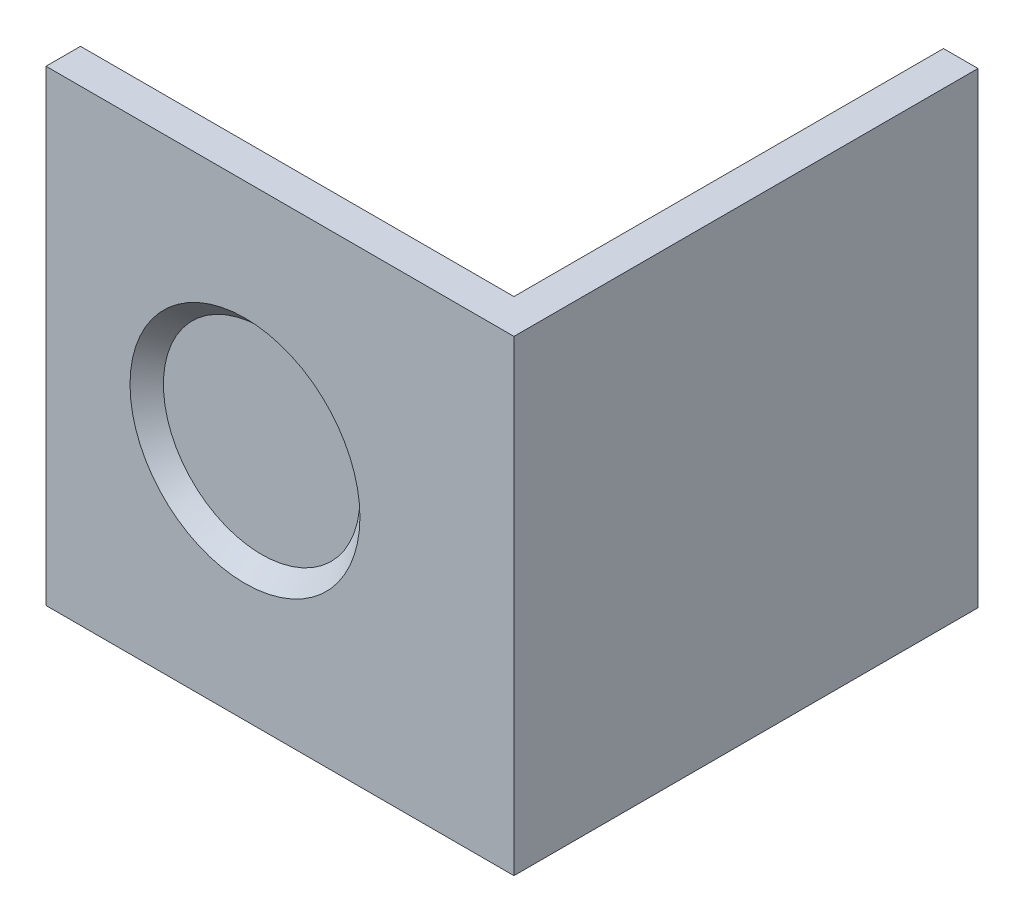
ISO-10303-21;
HEADER;
FILE_DESCRIPTION(('STEP AP214'),'2;1');
FILE_NAME('part.step','',(''),(''),'','','');
FILE_SCHEMA(('AUTOMOTIVE_DESIGN { 1 0 10303 214 1 1 1 1 }'));
ENDSEC;
DATA;
#1=APPLICATION_CONTEXT('core data for automotive mechanical design processes');
#2=APPLICATION_PROTOCOL_DEFINITION('international standard','automotive_design',2000,#1);
#3=PRODUCT_CONTEXT('',#1,'mechanical');
#4=PRODUCT('Part','Part','',(#3));
#5=PRODUCT_RELATED_PRODUCT_CATEGORY('part','',(#4));
#6=PRODUCT_DEFINITION_FORMATION('','',#4);
#7=PRODUCT_DEFINITION_CONTEXT('part definition',#1,'design');
#8=PRODUCT_DEFINITION('design','',#6,#7);
#9=PRODUCT_DEFINITION_SHAPE('','',#8);
#10=(LENGTH_UNIT() NAMED_UNIT(*) SI_UNIT(.MILLI.,.METRE.));
#11=(NAMED_UNIT(*) PLANE_ANGLE_UNIT() SI_UNIT($,.RADIAN.));
#12=(NAMED_UNIT(*) SI_UNIT($,.STERADIAN.) SOLID_ANGLE_UNIT());
#13=UNCERTAINTY_MEASURE_WITH_UNIT(LENGTH_MEASURE(1.E-05),#10,'distance_accuracy_value','');
#14=(GEOMETRIC_REPRESENTATION_CONTEXT(3) GLOBAL_UNCERTAINTY_ASSIGNED_CONTEXT((#13)) GLOBAL_UNIT_ASSIGNED_CONTEXT((#10,
#11,#12)) REPRESENTATION_CONTEXT('',''));
#15=CARTESIAN_POINT('',(0.,0.,0.));
#16=DIRECTION('',(0.,0.,1.));
#17=DIRECTION('',(1.,0.,0.));
#18=AXIS2_PLACEMENT_3D('',#15,#16,#17);
#19=CARTESIAN_POINT('',(0.,41.97,0.));
#20=DIRECTION('',(0.,0.,-1.));
#21=DIRECTION('',(-1.,0.,0.));
#22=AXIS2_PLACEMENT_3D('',#19,#20,#21);
#23=PLANE('',#22);
#24=CARTESIAN_POINT('',(17.88,20.985,0.));
#25=DIRECTION('',(0.,0.,1.));
#26=DIRECTION('',(1.,0.,0.));
#27=AXIS2_PLACEMENT_3D('',#24,#25,#26);
#28=CIRCLE('',#27,10.33);
#29=CARTESIAN_POINT('',(28.21,20.985,0.));
#30=VERTEX_POINT('',#29);
#31=EDGE_CURVE('E184',#30,#30,#28,.F.);
#32=ORIENTED_EDGE('',*,*,#31,.T.);
#33=EDGE_LOOP('',(#32));
#34=FACE_BOUND('',#33,.T.);
#35=DIRECTION('',(1.,0.,0.));
#36=VECTOR('',#35,1.);
#37=CARTESIAN_POINT('',(0.,0.,0.));
#38=LINE('',#37,#36);
#39=CARTESIAN_POINT('',(0.,0.,0.));
#40=VERTEX_POINT('',#39);
#41=CARTESIAN_POINT('',(42.05,0.,0.));
#42=VERTEX_POINT('',#41);
#43=EDGE_CURVE('E132',#40,#42,#38,.T.);
#44=ORIENTED_EDGE('',*,*,#43,.T.);
#45=DIRECTION('',(0.,-1.,0.));
#46=VECTOR('',#45,1.);
#47=CARTESIAN_POINT('',(42.05,41.97,0.));
#48=LINE('',#47,#46);
#49=CARTESIAN_POINT('',(42.05,41.97,0.));
#50=VERTEX_POINT('',#49);
#51=EDGE_CURVE('E11',#50,#42,#48,.T.);
#52=ORIENTED_EDGE('',*,*,#51,.F.);
#53=DIRECTION('',(1.,0.,0.));
#54=VECTOR('',#53,1.);
#55=CARTESIAN_POINT('',(0.,41.97,0.));
#56=LINE('',#55,#54);
#57=CARTESIAN_POINT('',(0.,41.97,0.));
#58=VERTEX_POINT('',#57);
#59=EDGE_CURVE('E149',#58,#50,#56,.T.);
#60=ORIENTED_EDGE('',*,*,#59,.F.);
#61=DIRECTION('',(0.,-1.,0.));
#62=VECTOR('',#61,1.);
#63=CARTESIAN_POINT('',(0.,41.97,0.));
#64=LINE('',#63,#62);
#65=EDGE_CURVE('E128',#58,#40,#64,.T.);
#66=ORIENTED_EDGE('',*,*,#65,.T.);
#67=EDGE_LOOP('',(#44,#52,#60,#66));
#68=FACE_BOUND('',#67,.T.);
#69=ADVANCED_FACE('F43',(#34,#68),#23,.F.);
#70=CARTESIAN_POINT('',(42.05,41.97,0.));
#71=DIRECTION('',(-1.,0.,0.));
#72=DIRECTION('',(0.,0.,1.));
#73=AXIS2_PLACEMENT_3D('',#70,#71,#72);
#74=PLANE('',#73);
#75=DIRECTION('',(0.,0.,-1.));
#76=VECTOR('',#75,1.);
#77=CARTESIAN_POINT('',(42.05,0.,0.));
#78=LINE('',#77,#76);
#79=CARTESIAN_POINT('',(42.05,0.,-41.6999999999999));
#80=VERTEX_POINT('',#79);
#81=EDGE_CURVE('E136',#42,#80,#78,.T.);
#82=ORIENTED_EDGE('',*,*,#81,.T.);
#83=DIRECTION('',(0.,-1.,0.));
#84=VECTOR('',#83,1.);
#85=CARTESIAN_POINT('',(42.05,41.97,-41.6999999999999));
#86=LINE('',#85,#84);
#87=CARTESIAN_POINT('',(42.05,41.97,-41.6999999999999));
#88=VERTEX_POINT('',#87);
#89=EDGE_CURVE('E52',#88,#80,#86,.T.);
#90=ORIENTED_EDGE('',*,*,#89,.F.);
#91=DIRECTION('',(0.,0.,-1.));
#92=VECTOR('',#91,1.);
#93=CARTESIAN_POINT('',(42.05,41.97,0.));
#94=LINE('',#93,#92);
#95=EDGE_CURVE('E97',#50,#88,#94,.T.);
#96=ORIENTED_EDGE('',*,*,#95,.F.);
#97=ORIENTED_EDGE('',*,*,#51,.T.);
#98=EDGE_LOOP('',(#82,#90,#96,#97));
#99=FACE_BOUND('',#98,.T.);
#100=ADVANCED_FACE('F177',(#99),#74,.F.);
#101=CARTESIAN_POINT('',(42.05,41.97,-41.6999999999999));
#102=DIRECTION('',(0.,0.,1.));
#103=DIRECTION('',(1.,0.,0.));
#104=AXIS2_PLACEMENT_3D('',#101,#102,#103);
#105=PLANE('',#104);
#106=DIRECTION('',(-1.,0.,0.));
#107=VECTOR('',#106,1.);
#108=CARTESIAN_POINT('',(42.05,0.,-41.6999999999999));
#109=LINE('',#108,#107);
#110=CARTESIAN_POINT('',(38.95,0.,-41.6999999999999));
#111=VERTEX_POINT('',#110);
#112=EDGE_CURVE('E140',#80,#111,#109,.T.);
#113=ORIENTED_EDGE('',*,*,#112,.T.);
#114=DIRECTION('',(0.,-1.,0.));
#115=VECTOR('',#114,1.);
#116=CARTESIAN_POINT('',(38.95,41.97,-41.6999999999999));
#117=LINE('',#116,#115);
#118=CARTESIAN_POINT('',(38.95,41.97,-41.6999999999999));
#119=VERTEX_POINT('',#118);
#120=EDGE_CURVE('E121',#119,#111,#117,.T.);
#121=ORIENTED_EDGE('',*,*,#120,.F.);
#122=DIRECTION('',(-1.,0.,0.));
#123=VECTOR('',#122,1.);
#124=CARTESIAN_POINT('',(42.05,41.97,-41.6999999999999));
#125=LINE('',#124,#123);
#126=EDGE_CURVE('E110',#88,#119,#125,.T.);
#127=ORIENTED_EDGE('',*,*,#126,.F.);
#128=ORIENTED_EDGE('',*,*,#89,.T.);
#129=EDGE_LOOP('',(#113,#121,#127,#128));
#130=FACE_BOUND('',#129,.T.);
#131=ADVANCED_FACE('F159',(#130),#105,.F.);
#132=CARTESIAN_POINT('',(38.95,41.97,-41.6999999999999));
#133=DIRECTION('',(1.,0.,0.));
#134=DIRECTION('',(0.,0.,-1.));
#135=AXIS2_PLACEMENT_3D('',#132,#133,#134);
#136=PLANE('',#135);
#137=DIRECTION('',(0.,0.,1.));
#138=VECTOR('',#137,1.);
#139=CARTESIAN_POINT('',(38.95,0.,-41.6999999999999));
#140=LINE('',#139,#138);
#141=CARTESIAN_POINT('',(38.95,0.,-3.1));
#142=VERTEX_POINT('',#141);
#143=EDGE_CURVE('E119',#111,#142,#140,.T.);
#144=ORIENTED_EDGE('',*,*,#143,.T.);
#145=DIRECTION('',(0.,-1.,0.));
#146=VECTOR('',#145,1.);
#147=CARTESIAN_POINT('',(38.95,41.97,-3.1));
#148=LINE('',#147,#146);
#149=CARTESIAN_POINT('',(38.95,41.97,-3.1));
#150=VERTEX_POINT('',#149);
#151=EDGE_CURVE('E116',#150,#142,#148,.T.);
#152=ORIENTED_EDGE('',*,*,#151,.F.);
#153=DIRECTION('',(0.,0.,1.));
#154=VECTOR('',#153,1.);
#155=CARTESIAN_POINT('',(38.95,41.97,-41.6999999999999));
#156=LINE('',#155,#154);
#157=EDGE_CURVE('E104',#119,#150,#156,.T.);
#158=ORIENTED_EDGE('',*,*,#157,.F.);
#159=ORIENTED_EDGE('',*,*,#120,.T.);
#160=EDGE_LOOP('',(#144,#152,#158,#159));
#161=FACE_BOUND('',#160,.T.);
#162=ADVANCED_FACE('F117',(#161),#136,.F.);
#163=CARTESIAN_POINT('',(38.95,41.97,-3.1));
#164=DIRECTION('',(0.,0.,1.));
#165=DIRECTION('',(1.,0.,0.));
#166=AXIS2_PLACEMENT_3D('',#163,#164,#165);
#167=PLANE('',#166);
#168=DIRECTION('',(-1.,0.,0.));
#169=VECTOR('',#168,1.);
#170=CARTESIAN_POINT('',(38.95,0.,-3.1));
#171=LINE('',#170,#169);
#172=CARTESIAN_POINT('',(0.,0.,-3.1000000000001));
#173=VERTEX_POINT('',#172);
#174=EDGE_CURVE('E83',#142,#173,#171,.T.);
#175=ORIENTED_EDGE('',*,*,#174,.T.);
#176=DIRECTION('',(0.,-1.,0.));
#177=VECTOR('',#176,1.);
#178=CARTESIAN_POINT('',(0.,41.97,-3.1000000000001));
#179=LINE('',#178,#177);
#180=CARTESIAN_POINT('',(0.,41.97,-3.1000000000001));
#181=VERTEX_POINT('',#180);
#182=EDGE_CURVE('E122',#181,#173,#179,.T.);
#183=ORIENTED_EDGE('',*,*,#182,.F.);
#184=DIRECTION('',(-1.,0.,0.));
#185=VECTOR('',#184,1.);
#186=CARTESIAN_POINT('',(38.95,41.97,-3.1));
#187=LINE('',#186,#185);
#188=EDGE_CURVE('E108',#150,#181,#187,.T.);
#189=ORIENTED_EDGE('',*,*,#188,.F.);
#190=ORIENTED_EDGE('',*,*,#151,.T.);
#191=EDGE_LOOP('',(#175,#183,#189,#190));
#192=FACE_BOUND('',#191,.T.);
#193=ADVANCED_FACE('F124',(#192),#167,.F.);
#194=CARTESIAN_POINT('',(0.,41.97,-3.1000000000001));
#195=DIRECTION('',(1.,0.,0.));
#196=DIRECTION('',(0.,0.,-1.));
#197=AXIS2_PLACEMENT_3D('',#194,#195,#196);
#198=PLANE('',#197);
#199=DIRECTION('',(0.,0.,1.));
#200=VECTOR('',#199,1.);
#201=CARTESIAN_POINT('',(0.,0.,-3.1000000000001));
#202=LINE('',#201,#200);
#203=EDGE_CURVE('E89',#173,#40,#202,.T.);
#204=ORIENTED_EDGE('',*,*,#203,.T.);
#205=ORIENTED_EDGE('',*,*,#65,.F.);
#206=DIRECTION('',(0.,0.,1.));
#207=VECTOR('',#206,1.);
#208=CARTESIAN_POINT('',(0.,41.97,-3.1000000000001));
#209=LINE('',#208,#207);
#210=EDGE_CURVE('E60',#181,#58,#209,.T.);
#211=ORIENTED_EDGE('',*,*,#210,.F.);
#212=ORIENTED_EDGE('',*,*,#182,.T.);
#213=EDGE_LOOP('',(#204,#205,#211,#212));
#214=FACE_BOUND('',#213,.T.);
#215=ADVANCED_FACE('F166',(#214),#198,.F.);
#216=CARTESIAN_POINT('',(0.,41.97,0.));
#217=DIRECTION('',(0.,1.,0.));
#218=DIRECTION('',(0.,0.,1.));
#219=AXIS2_PLACEMENT_3D('',#216,#217,#218);
#220=PLANE('',#219);
#221=ORIENTED_EDGE('',*,*,#59,.T.);
#222=ORIENTED_EDGE('',*,*,#95,.T.);
#223=ORIENTED_EDGE('',*,*,#126,.T.);
#224=ORIENTED_EDGE('',*,*,#157,.T.);
#225=ORIENTED_EDGE('',*,*,#188,.T.);
#226=ORIENTED_EDGE('',*,*,#210,.T.);
#227=EDGE_LOOP('',(#221,#222,#223,#224,#225,#226));
#228=FACE_BOUND('',#227,.T.);
#229=ADVANCED_FACE('F106',(#228),#220,.T.);
#230=CARTESIAN_POINT('',(0.,0.,0.));
#231=DIRECTION('',(0.,1.,0.));
#232=DIRECTION('',(0.,0.,1.));
#233=AXIS2_PLACEMENT_3D('',#230,#231,#232);
#234=PLANE('',#233);
#235=ORIENTED_EDGE('',*,*,#43,.F.);
#236=ORIENTED_EDGE('',*,*,#203,.F.);
#237=ORIENTED_EDGE('',*,*,#174,.F.);
#238=ORIENTED_EDGE('',*,*,#143,.F.);
#239=ORIENTED_EDGE('',*,*,#112,.F.);
#240=ORIENTED_EDGE('',*,*,#81,.F.);
#241=EDGE_LOOP('',(#235,#236,#237,#238,#239,#240));
#242=FACE_BOUND('',#241,.T.);
#243=ADVANCED_FACE('F162',(#242),#234,.F.);
#244=CARTESIAN_POINT('',(17.88,20.985,0.));
#245=DIRECTION('',(0.,0.,1.));
#246=DIRECTION('',(1.,0.,0.));
#247=AXIS2_PLACEMENT_3D('',#244,#245,#246);
#248=CONICAL_SURFACE('',#247,10.33,0.78539816339745);
#249=CARTESIAN_POINT('',(17.88,20.985,-1.5));
#250=DIRECTION('',(0.,0.,1.));
#251=DIRECTION('',(1.,0.,0.));
#252=AXIS2_PLACEMENT_3D('',#249,#250,#251);
#253=CIRCLE('',#252,8.83);
#254=CARTESIAN_POINT('',(26.71,20.985,-1.5));
#255=VERTEX_POINT('',#254);
#256=EDGE_CURVE('E137',#255,#255,#253,.F.);
#257=ORIENTED_EDGE('',*,*,#256,.T.);
#258=EDGE_LOOP('',(#257));
#259=FACE_BOUND('',#258,.T.);
#260=ORIENTED_EDGE('',*,*,#31,.F.);
#261=EDGE_LOOP('',(#260));
#262=FACE_BOUND('',#261,.T.);
#263=ADVANCED_FACE('F198',(#259,#262),#248,.F.);
#264=CARTESIAN_POINT('',(0.,0.,-1.5));
#265=DIRECTION('',(0.,0.,1.));
#266=DIRECTION('',(1.,0.,0.));
#267=AXIS2_PLACEMENT_3D('',#264,#265,#266);
#268=PLANE('',#267);
#269=ORIENTED_EDGE('',*,*,#256,.F.);
#270=EDGE_LOOP('',(#269));
#271=FACE_BOUND('',#270,.T.);
#272=ADVANCED_FACE('F200',(#271),#268,.T.);
#273=CLOSED_SHELL('',(#69,#100,#131,#162,#193,#215,#229,#243,#263,#272));
#274=MANIFOLD_SOLID_BREP('B2',#273);
#275=ADVANCED_BREP_SHAPE_REPRESENTATION('',(#18,#274),#14);
#276=SHAPE_DEFINITION_REPRESENTATION(#9,#275);
ENDSEC;
END-ISO-10303-21;
